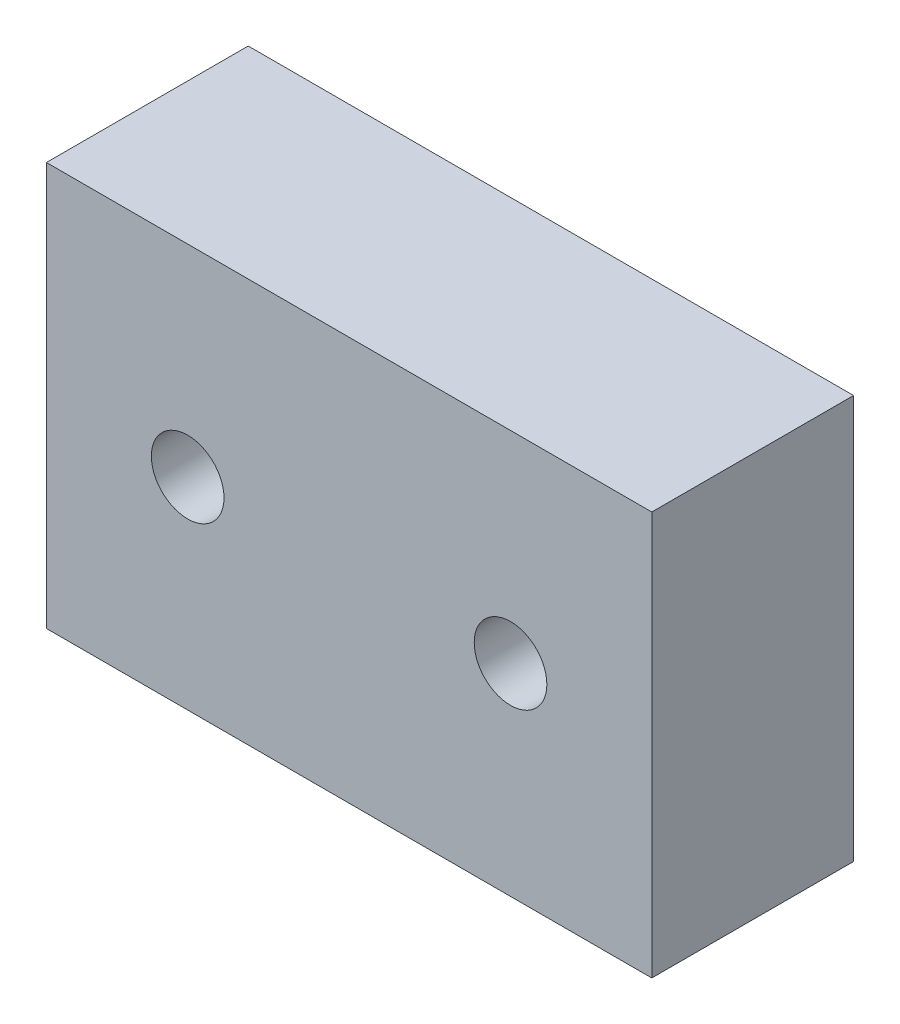
ISO-10303-21;
HEADER;
FILE_DESCRIPTION(('STEP AP214'),'2;1');
FILE_NAME('part.step','',(''),(''),'','','');
FILE_SCHEMA(('AUTOMOTIVE_DESIGN { 1 0 10303 214 1 1 1 1 }'));
ENDSEC;
DATA;
#1=APPLICATION_CONTEXT('core data for automotive mechanical design processes');
#2=APPLICATION_PROTOCOL_DEFINITION('international standard','automotive_design',2000,#1);
#3=PRODUCT_CONTEXT('',#1,'mechanical');
#4=PRODUCT('Part','Part','',(#3));
#5=PRODUCT_RELATED_PRODUCT_CATEGORY('part','',(#4));
#6=PRODUCT_DEFINITION_FORMATION('','',#4);
#7=PRODUCT_DEFINITION_CONTEXT('part definition',#1,'design');
#8=PRODUCT_DEFINITION('design','',#6,#7);
#9=PRODUCT_DEFINITION_SHAPE('','',#8);
#10=(LENGTH_UNIT() NAMED_UNIT(*) SI_UNIT(.MILLI.,.METRE.));
#11=(NAMED_UNIT(*) PLANE_ANGLE_UNIT() SI_UNIT($,.RADIAN.));
#12=(NAMED_UNIT(*) SI_UNIT($,.STERADIAN.) SOLID_ANGLE_UNIT());
#13=UNCERTAINTY_MEASURE_WITH_UNIT(LENGTH_MEASURE(1.E-05),#10,'distance_accuracy_value','');
#14=(GEOMETRIC_REPRESENTATION_CONTEXT(3) GLOBAL_UNCERTAINTY_ASSIGNED_CONTEXT((#13)) GLOBAL_UNIT_ASSIGNED_CONTEXT((#10,
#11,#12)) REPRESENTATION_CONTEXT('',''));
#15=CARTESIAN_POINT('',(0.,0.,0.));
#16=DIRECTION('',(0.,0.,1.));
#17=DIRECTION('',(1.,0.,0.));
#18=AXIS2_PLACEMENT_3D('',#15,#16,#17);
#19=CARTESIAN_POINT('',(-25.422006262813,-23.608262445374,-2.));
#20=DIRECTION('',(-1.,0.,0.));
#21=DIRECTION('',(0.,0.,1.));
#22=AXIS2_PLACEMENT_3D('',#19,#20,#21);
#23=PLANE('',#22);
#24=DIRECTION('',(0.,0.,1.));
#25=VECTOR('',#24,1.);
#26=CARTESIAN_POINT('',(-25.422006262813,-33.608262445374,-2.));
#27=LINE('',#26,#25);
#28=CARTESIAN_POINT('',(-25.422006262813,-33.608262445374,-2.));
#29=VERTEX_POINT('',#28);
#30=CARTESIAN_POINT('',(-25.422006262813,-33.608262445374,3.));
#31=VERTEX_POINT('',#30);
#32=EDGE_CURVE('E119',#29,#31,#27,.T.);
#33=ORIENTED_EDGE('',*,*,#32,.T.);
#34=DIRECTION('',(0.,-1.,0.));
#35=VECTOR('',#34,1.);
#36=CARTESIAN_POINT('',(-25.422006262813,-23.608262445374,3.));
#37=LINE('',#36,#35);
#38=CARTESIAN_POINT('',(-25.422006262813,-23.608262445374,3.));
#39=VERTEX_POINT('',#38);
#40=EDGE_CURVE('E99',#39,#31,#37,.T.);
#41=ORIENTED_EDGE('',*,*,#40,.F.);
#42=DIRECTION('',(0.,0.,1.));
#43=VECTOR('',#42,1.);
#44=CARTESIAN_POINT('',(-25.422006262813,-23.608262445374,-2.));
#45=LINE('',#44,#43);
#46=CARTESIAN_POINT('',(-25.422006262813,-23.608262445374,-2.));
#47=VERTEX_POINT('',#46);
#48=EDGE_CURVE('E11',#47,#39,#45,.T.);
#49=ORIENTED_EDGE('',*,*,#48,.F.);
#50=DIRECTION('',(0.,-1.,0.));
#51=VECTOR('',#50,1.);
#52=CARTESIAN_POINT('',(-25.422006262813,-23.608262445374,-2.));
#53=LINE('',#52,#51);
#54=EDGE_CURVE('E111',#47,#29,#53,.T.);
#55=ORIENTED_EDGE('',*,*,#54,.T.);
#56=EDGE_LOOP('',(#33,#41,#49,#55));
#57=FACE_BOUND('',#56,.T.);
#58=ADVANCED_FACE('F33',(#57),#23,.T.);
#59=CARTESIAN_POINT('',(-10.422006262813,-23.608262445374,-2.));
#60=DIRECTION('',(0.,1.,0.));
#61=DIRECTION('',(0.,0.,1.));
#62=AXIS2_PLACEMENT_3D('',#59,#60,#61);
#63=PLANE('',#62);
#64=ORIENTED_EDGE('',*,*,#48,.T.);
#65=DIRECTION('',(-1.,0.,0.));
#66=VECTOR('',#65,1.);
#67=CARTESIAN_POINT('',(-10.422006262813,-23.608262445374,3.));
#68=LINE('',#67,#66);
#69=CARTESIAN_POINT('',(-10.422006262813,-23.608262445374,3.));
#70=VERTEX_POINT('',#69);
#71=EDGE_CURVE('E108',#70,#39,#68,.T.);
#72=ORIENTED_EDGE('',*,*,#71,.F.);
#73=DIRECTION('',(0.,0.,1.));
#74=VECTOR('',#73,1.);
#75=CARTESIAN_POINT('',(-10.422006262813,-23.608262445374,-2.));
#76=LINE('',#75,#74);
#77=CARTESIAN_POINT('',(-10.422006262813,-23.608262445374,-2.));
#78=VERTEX_POINT('',#77);
#79=EDGE_CURVE('E41',#78,#70,#76,.T.);
#80=ORIENTED_EDGE('',*,*,#79,.F.);
#81=DIRECTION('',(-1.,0.,0.));
#82=VECTOR('',#81,1.);
#83=CARTESIAN_POINT('',(-10.422006262813,-23.608262445374,-2.));
#84=LINE('',#83,#82);
#85=EDGE_CURVE('E118',#78,#47,#84,.T.);
#86=ORIENTED_EDGE('',*,*,#85,.T.);
#87=EDGE_LOOP('',(#64,#72,#80,#86));
#88=FACE_BOUND('',#87,.T.);
#89=ADVANCED_FACE('F130',(#88),#63,.T.);
#90=CARTESIAN_POINT('',(-10.422006262813,-33.608262445374,-2.));
#91=DIRECTION('',(1.,0.,0.));
#92=DIRECTION('',(0.,0.,-1.));
#93=AXIS2_PLACEMENT_3D('',#90,#91,#92);
#94=PLANE('',#93);
#95=ORIENTED_EDGE('',*,*,#79,.T.);
#96=DIRECTION('',(0.,1.,0.));
#97=VECTOR('',#96,1.);
#98=CARTESIAN_POINT('',(-10.422006262813,-33.608262445374,3.));
#99=LINE('',#98,#97);
#100=CARTESIAN_POINT('',(-10.422006262813,-33.608262445374,3.));
#101=VERTEX_POINT('',#100);
#102=EDGE_CURVE('E105',#101,#70,#99,.T.);
#103=ORIENTED_EDGE('',*,*,#102,.F.);
#104=DIRECTION('',(0.,0.,1.));
#105=VECTOR('',#104,1.);
#106=CARTESIAN_POINT('',(-10.422006262813,-33.608262445374,-2.));
#107=LINE('',#106,#105);
#108=CARTESIAN_POINT('',(-10.422006262813,-33.608262445374,-2.));
#109=VERTEX_POINT('',#108);
#110=EDGE_CURVE('E122',#109,#101,#107,.T.);
#111=ORIENTED_EDGE('',*,*,#110,.F.);
#112=DIRECTION('',(0.,1.,0.));
#113=VECTOR('',#112,1.);
#114=CARTESIAN_POINT('',(-10.422006262813,-33.608262445374,-2.));
#115=LINE('',#114,#113);
#116=EDGE_CURVE('E116',#109,#78,#115,.T.);
#117=ORIENTED_EDGE('',*,*,#116,.T.);
#118=EDGE_LOOP('',(#95,#103,#111,#117));
#119=FACE_BOUND('',#118,.T.);
#120=ADVANCED_FACE('F136',(#119),#94,.T.);
#121=CARTESIAN_POINT('',(-25.422006262813,-33.608262445374,-2.));
#122=DIRECTION('',(0.,-1.,0.));
#123=DIRECTION('',(0.,0.,-1.));
#124=AXIS2_PLACEMENT_3D('',#121,#122,#123);
#125=PLANE('',#124);
#126=CARTESIAN_POINT('',(-17.922006262813,-33.608262445374,0.499999999999998));
#127=DIRECTION('',(0.,-1.,0.));
#128=DIRECTION('',(0.,0.,-1.));
#129=AXIS2_PLACEMENT_3D('',#126,#127,#128);
#130=CIRCLE('',#129,1.5);
#131=CARTESIAN_POINT('',(-17.922006262813,-33.608262445374,-1.));
#132=VERTEX_POINT('',#131);
#133=EDGE_CURVE('E86',#132,#132,#130,.T.);
#134=ORIENTED_EDGE('',*,*,#133,.F.);
#135=EDGE_LOOP('',(#134));
#136=FACE_BOUND('',#135,.T.);
#137=ORIENTED_EDGE('',*,*,#110,.T.);
#138=DIRECTION('',(1.,0.,0.));
#139=VECTOR('',#138,1.);
#140=CARTESIAN_POINT('',(-25.422006262813,-33.608262445374,3.));
#141=LINE('',#140,#139);
#142=EDGE_CURVE('E102',#31,#101,#141,.T.);
#143=ORIENTED_EDGE('',*,*,#142,.F.);
#144=ORIENTED_EDGE('',*,*,#32,.F.);
#145=DIRECTION('',(1.,0.,0.));
#146=VECTOR('',#145,1.);
#147=CARTESIAN_POINT('',(-25.422006262813,-33.608262445374,-2.));
#148=LINE('',#147,#146);
#149=EDGE_CURVE('E113',#29,#109,#148,.T.);
#150=ORIENTED_EDGE('',*,*,#149,.T.);
#151=EDGE_LOOP('',(#137,#143,#144,#150));
#152=FACE_BOUND('',#151,.T.);
#153=ADVANCED_FACE('F126',(#136,#152),#125,.T.);
#154=CARTESIAN_POINT('',(0.,0.,-2.));
#155=DIRECTION('',(0.,0.,1.));
#156=DIRECTION('',(1.,0.,0.));
#157=AXIS2_PLACEMENT_3D('',#154,#155,#156);
#158=PLANE('',#157);
#159=CARTESIAN_POINT('',(-21.922006262813,-28.608262445374,-2.));
#160=DIRECTION('',(0.,0.,-1.));
#161=DIRECTION('',(-1.,0.,0.));
#162=AXIS2_PLACEMENT_3D('',#159,#160,#161);
#163=CIRCLE('',#162,0.899999999999998);
#164=CARTESIAN_POINT('',(-22.822006262813,-28.608262445374,-2.));
#165=VERTEX_POINT('',#164);
#166=EDGE_CURVE('E85',#165,#165,#163,.T.);
#167=ORIENTED_EDGE('',*,*,#166,.F.);
#168=EDGE_LOOP('',(#167));
#169=FACE_BOUND('',#168,.T.);
#170=CARTESIAN_POINT('',(-13.922006262813,-28.608262445374,-2.));
#171=DIRECTION('',(0.,0.,-1.));
#172=DIRECTION('',(-1.,0.,0.));
#173=AXIS2_PLACEMENT_3D('',#170,#171,#172);
#174=CIRCLE('',#173,0.899999999999996);
#175=CARTESIAN_POINT('',(-14.822006262813,-28.608262445374,-2.));
#176=VERTEX_POINT('',#175);
#177=EDGE_CURVE('E93',#176,#176,#174,.T.);
#178=ORIENTED_EDGE('',*,*,#177,.F.);
#179=EDGE_LOOP('',(#178));
#180=FACE_BOUND('',#179,.T.);
#181=ORIENTED_EDGE('',*,*,#54,.F.);
#182=ORIENTED_EDGE('',*,*,#85,.F.);
#183=ORIENTED_EDGE('',*,*,#116,.F.);
#184=ORIENTED_EDGE('',*,*,#149,.F.);
#185=EDGE_LOOP('',(#181,#182,#183,#184));
#186=FACE_BOUND('',#185,.T.);
#187=ADVANCED_FACE('F134',(#169,#180,#186),#158,.F.);
#188=CARTESIAN_POINT('',(0.,0.,3.));
#189=DIRECTION('',(0.,0.,1.));
#190=DIRECTION('',(1.,0.,0.));
#191=AXIS2_PLACEMENT_3D('',#188,#189,#190);
#192=PLANE('',#191);
#193=CARTESIAN_POINT('',(-21.922006262813,-28.608262445374,3.));
#194=DIRECTION('',(0.,0.,1.));
#195=DIRECTION('',(1.,0.,0.));
#196=AXIS2_PLACEMENT_3D('',#193,#194,#195);
#197=CIRCLE('',#196,0.899999999999996);
#198=CARTESIAN_POINT('',(-21.022006262813,-28.608262445374,3.));
#199=VERTEX_POINT('',#198);
#200=EDGE_CURVE('E36',#199,#199,#197,.T.);
#201=ORIENTED_EDGE('',*,*,#200,.F.);
#202=EDGE_LOOP('',(#201));
#203=FACE_BOUND('',#202,.T.);
#204=CARTESIAN_POINT('',(-13.922006262813,-28.608262445374,3.));
#205=DIRECTION('',(0.,0.,1.));
#206=DIRECTION('',(1.,0.,0.));
#207=AXIS2_PLACEMENT_3D('',#204,#205,#206);
#208=CIRCLE('',#207,0.899999999999995);
#209=CARTESIAN_POINT('',(-13.022006262813,-28.608262445374,3.));
#210=VERTEX_POINT('',#209);
#211=EDGE_CURVE('E96',#210,#210,#208,.T.);
#212=ORIENTED_EDGE('',*,*,#211,.F.);
#213=EDGE_LOOP('',(#212));
#214=FACE_BOUND('',#213,.T.);
#215=ORIENTED_EDGE('',*,*,#40,.T.);
#216=ORIENTED_EDGE('',*,*,#142,.T.);
#217=ORIENTED_EDGE('',*,*,#102,.T.);
#218=ORIENTED_EDGE('',*,*,#71,.T.);
#219=EDGE_LOOP('',(#215,#216,#217,#218));
#220=FACE_BOUND('',#219,.T.);
#221=ADVANCED_FACE('F129',(#203,#214,#220),#192,.T.);
#222=CARTESIAN_POINT('',(-13.922006262813,-28.608262445374,-2.));
#223=DIRECTION('',(0.,0.,-1.));
#224=DIRECTION('',(-1.,0.,0.));
#225=AXIS2_PLACEMENT_3D('',#222,#223,#224);
#226=CYLINDRICAL_SURFACE('',#225,0.899999999999995);
#227=ORIENTED_EDGE('',*,*,#211,.T.);
#228=EDGE_LOOP('',(#227));
#229=FACE_BOUND('',#228,.T.);
#230=ORIENTED_EDGE('',*,*,#177,.T.);
#231=EDGE_LOOP('',(#230));
#232=FACE_BOUND('',#231,.T.);
#233=ADVANCED_FACE('F175',(#229,#232),#226,.F.);
#234=CARTESIAN_POINT('',(-21.922006262813,-28.608262445374,-2.));
#235=DIRECTION('',(0.,0.,-1.));
#236=DIRECTION('',(-1.,0.,0.));
#237=AXIS2_PLACEMENT_3D('',#234,#235,#236);
#238=CYLINDRICAL_SURFACE('',#237,0.899999999999996);
#239=ORIENTED_EDGE('',*,*,#200,.T.);
#240=EDGE_LOOP('',(#239));
#241=FACE_BOUND('',#240,.T.);
#242=ORIENTED_EDGE('',*,*,#166,.T.);
#243=EDGE_LOOP('',(#242));
#244=FACE_BOUND('',#243,.T.);
#245=ADVANCED_FACE('F79',(#241,#244),#238,.F.);
#246=CARTESIAN_POINT('',(-17.922006262813,-30.608262445374,0.499999999999998));
#247=DIRECTION('',(0.,-1.,0.));
#248=DIRECTION('',(0.,0.,-1.));
#249=AXIS2_PLACEMENT_3D('',#246,#247,#248);
#250=CONICAL_SURFACE('',#249,1.5,1.02974425867665);
#251=CARTESIAN_POINT('',(-17.922006262813,-29.7069715168326,0.499999999999998));
#252=VERTEX_POINT('',#251);
#253=VERTEX_LOOP('',#252);
#254=FACE_BOUND('',#253,.T.);
#255=CARTESIAN_POINT('',(-17.922006262813,-30.608262445374,0.499999999999998));
#256=DIRECTION('',(0.,-1.,0.));
#257=DIRECTION('',(0.,0.,-1.));
#258=AXIS2_PLACEMENT_3D('',#255,#256,#257);
#259=CIRCLE('',#258,1.5);
#260=CARTESIAN_POINT('',(-17.922006262813,-30.608262445374,-1.));
#261=VERTEX_POINT('',#260);
#262=EDGE_CURVE('E83',#261,#261,#259,.T.);
#263=ORIENTED_EDGE('',*,*,#262,.T.);
#264=EDGE_LOOP('',(#263));
#265=FACE_BOUND('',#264,.T.);
#266=ADVANCED_FACE('F75',(#254,#265),#250,.F.);
#267=CARTESIAN_POINT('',(-17.922006262813,-33.608262445374,0.499999999999998));
#268=DIRECTION('',(0.,-1.,0.));
#269=DIRECTION('',(0.,0.,-1.));
#270=AXIS2_PLACEMENT_3D('',#267,#268,#269);
#271=CYLINDRICAL_SURFACE('',#270,1.5);
#272=ORIENTED_EDGE('',*,*,#262,.F.);
#273=EDGE_LOOP('',(#272));
#274=FACE_BOUND('',#273,.T.);
#275=ORIENTED_EDGE('',*,*,#133,.T.);
#276=EDGE_LOOP('',(#275));
#277=FACE_BOUND('',#276,.T.);
#278=ADVANCED_FACE('F78',(#274,#277),#271,.F.);
#279=CLOSED_SHELL('',(#58,#89,#120,#153,#187,#221,#233,#245,#266,#278));
#280=MANIFOLD_SOLID_BREP('B2',#279);
#281=ADVANCED_BREP_SHAPE_REPRESENTATION('',(#18,#280),#14);
#282=SHAPE_DEFINITION_REPRESENTATION(#9,#281);
ENDSEC;
END-ISO-10303-21;
